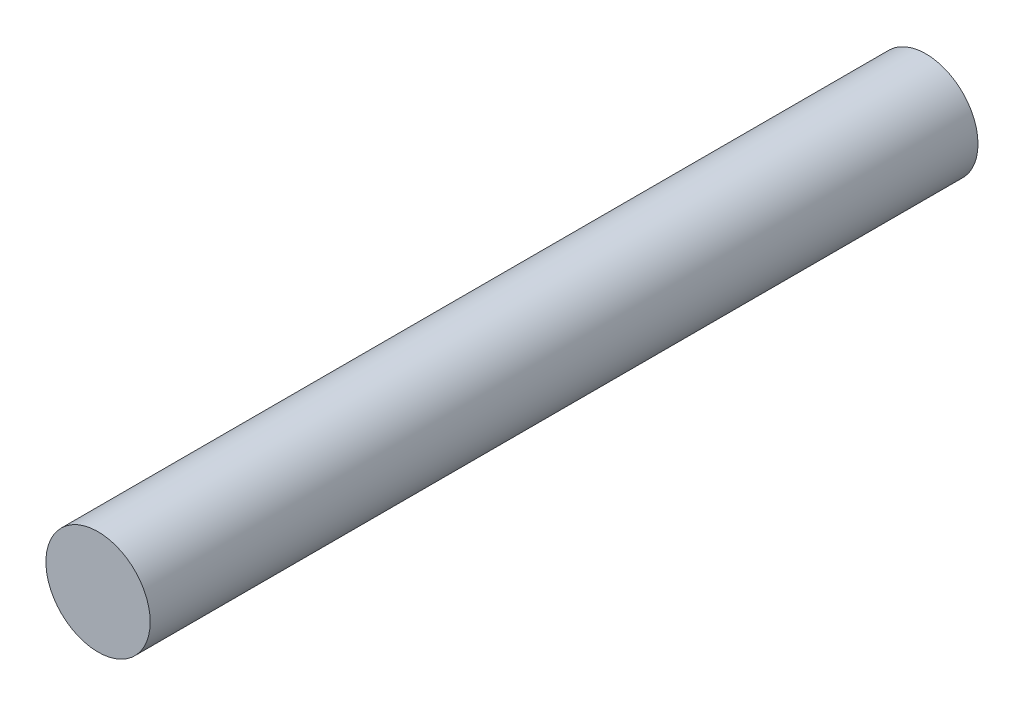
ISO-10303-21;
HEADER;
FILE_DESCRIPTION(('STEP AP214'),'2;1');
FILE_NAME('part.step','',(''),(''),'','','');
FILE_SCHEMA(('AUTOMOTIVE_DESIGN { 1 0 10303 214 1 1 1 1 }'));
ENDSEC;
DATA;
#1=APPLICATION_CONTEXT('core data for automotive mechanical design processes');
#2=APPLICATION_PROTOCOL_DEFINITION('international standard','automotive_design',2000,#1);
#3=PRODUCT_CONTEXT('',#1,'mechanical');
#4=PRODUCT('Part','Part','',(#3));
#5=PRODUCT_RELATED_PRODUCT_CATEGORY('part','',(#4));
#6=PRODUCT_DEFINITION_FORMATION('','',#4);
#7=PRODUCT_DEFINITION_CONTEXT('part definition',#1,'design');
#8=PRODUCT_DEFINITION('design','',#6,#7);
#9=PRODUCT_DEFINITION_SHAPE('','',#8);
#10=(LENGTH_UNIT() NAMED_UNIT(*) SI_UNIT(.MILLI.,.METRE.));
#11=(NAMED_UNIT(*) PLANE_ANGLE_UNIT() SI_UNIT($,.RADIAN.));
#12=(NAMED_UNIT(*) SI_UNIT($,.STERADIAN.) SOLID_ANGLE_UNIT());
#13=UNCERTAINTY_MEASURE_WITH_UNIT(LENGTH_MEASURE(1.E-05),#10,'distance_accuracy_value','');
#14=(GEOMETRIC_REPRESENTATION_CONTEXT(3) GLOBAL_UNCERTAINTY_ASSIGNED_CONTEXT((#13)) GLOBAL_UNIT_ASSIGNED_CONTEXT((#10,
#11,#12)) REPRESENTATION_CONTEXT('',''));
#15=CARTESIAN_POINT('',(0.,0.,0.));
#16=DIRECTION('',(0.,0.,1.));
#17=DIRECTION('',(1.,0.,0.));
#18=AXIS2_PLACEMENT_3D('',#15,#16,#17);
#19=CARTESIAN_POINT('',(0.,0.,31.75));
#20=DIRECTION('',(0.,0.,-1.));
#21=DIRECTION('',(-1.,0.,0.));
#22=AXIS2_PLACEMENT_3D('',#19,#20,#21);
#23=CYLINDRICAL_SURFACE('',#22,1.999996);
#24=CARTESIAN_POINT('',(0.,0.,31.75));
#25=DIRECTION('',(0.,0.,1.));
#26=DIRECTION('',(1.,0.,0.));
#27=AXIS2_PLACEMENT_3D('',#24,#25,#26);
#28=CIRCLE('',#27,1.999996);
#29=CARTESIAN_POINT('',(1.999996,0.,31.75));
#30=VERTEX_POINT('',#29);
#31=EDGE_CURVE('E10',#30,#30,#28,.T.);
#32=ORIENTED_EDGE('',*,*,#31,.F.);
#33=EDGE_LOOP('',(#32));
#34=FACE_BOUND('',#33,.T.);
#35=CARTESIAN_POINT('',(0.,0.,0.));
#36=DIRECTION('',(0.,0.,1.));
#37=DIRECTION('',(1.,0.,0.));
#38=AXIS2_PLACEMENT_3D('',#35,#36,#37);
#39=CIRCLE('',#38,1.999996);
#40=CARTESIAN_POINT('',(1.999996,0.,0.));
#41=VERTEX_POINT('',#40);
#42=EDGE_CURVE('E40',#41,#41,#39,.T.);
#43=ORIENTED_EDGE('',*,*,#42,.T.);
#44=EDGE_LOOP('',(#43));
#45=FACE_BOUND('',#44,.T.);
#46=ADVANCED_FACE('F37',(#34,#45),#23,.T.);
#47=CARTESIAN_POINT('',(0.,0.,31.75));
#48=DIRECTION('',(0.,0.,1.));
#49=DIRECTION('',(1.,0.,0.));
#50=AXIS2_PLACEMENT_3D('',#47,#48,#49);
#51=PLANE('',#50);
#52=ORIENTED_EDGE('',*,*,#31,.T.);
#53=EDGE_LOOP('',(#52));
#54=FACE_BOUND('',#53,.T.);
#55=ADVANCED_FACE('F52',(#54),#51,.T.);
#56=CARTESIAN_POINT('',(0.,0.,0.));
#57=DIRECTION('',(0.,0.,1.));
#58=DIRECTION('',(1.,0.,0.));
#59=AXIS2_PLACEMENT_3D('',#56,#57,#58);
#60=PLANE('',#59);
#61=ORIENTED_EDGE('',*,*,#42,.F.);
#62=EDGE_LOOP('',(#61));
#63=FACE_BOUND('',#62,.T.);
#64=ADVANCED_FACE('F50',(#63),#60,.F.);
#65=CLOSED_SHELL('',(#46,#55,#64));
#66=MANIFOLD_SOLID_BREP('B2',#65);
#67=ADVANCED_BREP_SHAPE_REPRESENTATION('',(#18,#66),#14);
#68=SHAPE_DEFINITION_REPRESENTATION(#9,#67);
ENDSEC;
END-ISO-10303-21;
